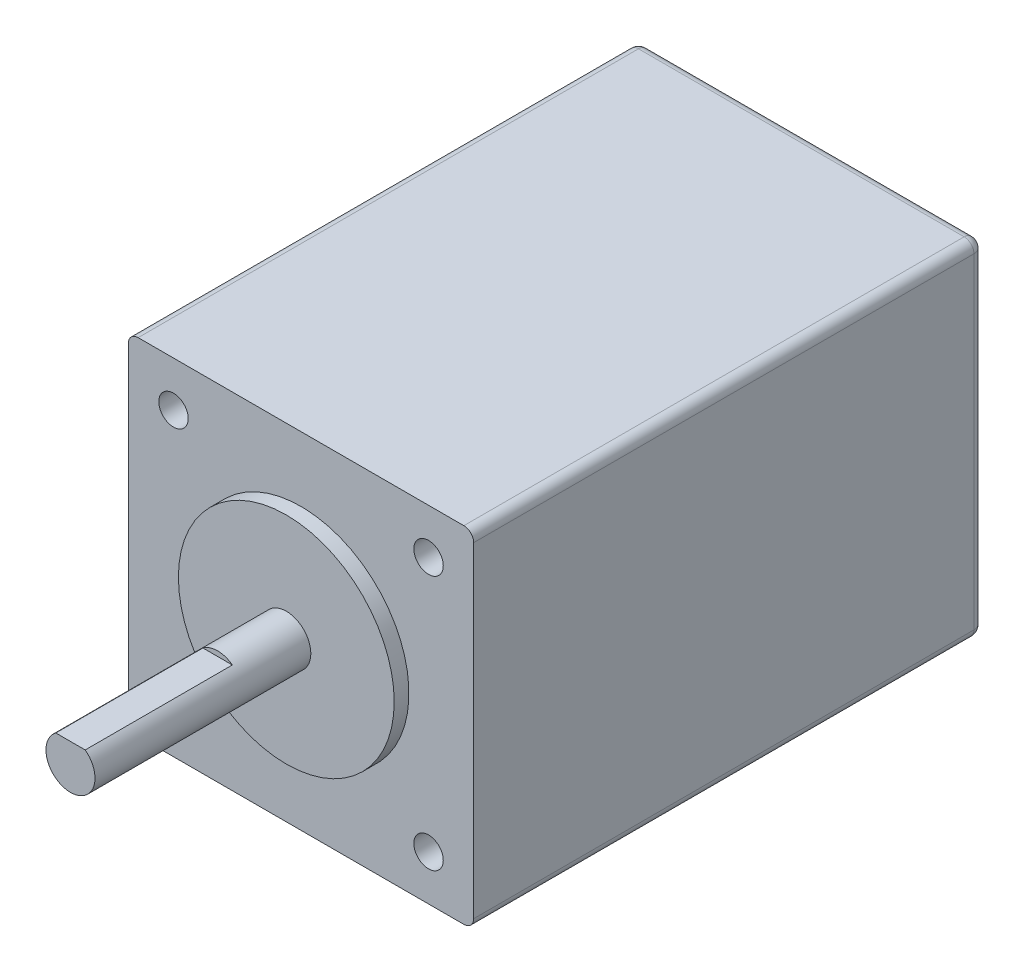
ISO-10303-21;
HEADER;
FILE_DESCRIPTION(('STEP AP214'),'2;1');
FILE_NAME('part.step','',(''),(''),'','','');
FILE_SCHEMA(('AUTOMOTIVE_DESIGN { 1 0 10303 214 1 1 1 1 }'));
ENDSEC;
DATA;
#1=APPLICATION_CONTEXT('core data for automotive mechanical design processes');
#2=APPLICATION_PROTOCOL_DEFINITION('international standard','automotive_design',2000,#1);
#3=PRODUCT_CONTEXT('',#1,'mechanical');
#4=PRODUCT('Part','Part','',(#3));
#5=PRODUCT_RELATED_PRODUCT_CATEGORY('part','',(#4));
#6=PRODUCT_DEFINITION_FORMATION('','',#4);
#7=PRODUCT_DEFINITION_CONTEXT('part definition',#1,'design');
#8=PRODUCT_DEFINITION('design','',#6,#7);
#9=PRODUCT_DEFINITION_SHAPE('','',#8);
#10=(LENGTH_UNIT() NAMED_UNIT(*) SI_UNIT(.MILLI.,.METRE.));
#11=(NAMED_UNIT(*) PLANE_ANGLE_UNIT() SI_UNIT($,.RADIAN.));
#12=(NAMED_UNIT(*) SI_UNIT($,.STERADIAN.) SOLID_ANGLE_UNIT());
#13=UNCERTAINTY_MEASURE_WITH_UNIT(LENGTH_MEASURE(1.E-05),#10,'distance_accuracy_value','');
#14=(GEOMETRIC_REPRESENTATION_CONTEXT(3) GLOBAL_UNCERTAINTY_ASSIGNED_CONTEXT((#13)) GLOBAL_UNIT_ASSIGNED_CONTEXT((#10,
#11,#12)) REPRESENTATION_CONTEXT('',''));
#15=CARTESIAN_POINT('',(0.,0.,0.));
#16=DIRECTION('',(0.,0.,1.));
#17=DIRECTION('',(1.,0.,0.));
#18=AXIS2_PLACEMENT_3D('',#15,#16,#17);
#19=CARTESIAN_POINT('',(0.,0.,53.5));
#20=DIRECTION('',(0.,0.,1.));
#21=DIRECTION('',(1.,0.,0.));
#22=AXIS2_PLACEMENT_3D('',#19,#20,#21);
#23=PLANE('',#22);
#24=CARTESIAN_POINT('',(0.,0.,53.5));
#25=DIRECTION('',(0.,0.,1.));
#26=DIRECTION('',(1.,0.,0.));
#27=AXIS2_PLACEMENT_3D('',#24,#25,#26);
#28=CIRCLE('',#27,11.);
#29=CARTESIAN_POINT('',(11.,0.,53.5));
#30=VERTEX_POINT('',#29);
#31=EDGE_CURVE('E144',#30,#30,#28,.T.);
#32=ORIENTED_EDGE('',*,*,#31,.T.);
#33=EDGE_LOOP('',(#32));
#34=FACE_BOUND('',#33,.T.);
#35=CARTESIAN_POINT('',(0.,0.,53.5));
#36=DIRECTION('',(0.,0.,1.));
#37=DIRECTION('',(1.,0.,0.));
#38=AXIS2_PLACEMENT_3D('',#35,#36,#37);
#39=CIRCLE('',#38,2.5);
#40=CARTESIAN_POINT('',(2.5,0.,53.5));
#41=VERTEX_POINT('',#40);
#42=EDGE_CURVE('E145',#41,#41,#39,.T.);
#43=ORIENTED_EDGE('',*,*,#42,.F.);
#44=EDGE_LOOP('',(#43));
#45=FACE_BOUND('',#44,.T.);
#46=ADVANCED_FACE('F33',(#34,#45),#23,.T.);
#47=CARTESIAN_POINT('',(17.6,17.6,52.));
#48=DIRECTION('',(0.,0.,-1.));
#49=DIRECTION('',(-1.,0.,0.));
#50=AXIS2_PLACEMENT_3D('',#47,#48,#49);
#51=PLANE('',#50);
#52=CARTESIAN_POINT('',(-12.9999999999997,-13.,52.));
#53=DIRECTION('',(0.,0.,1.));
#54=DIRECTION('',(1.,0.,0.));
#55=AXIS2_PLACEMENT_3D('',#52,#53,#54);
#56=CIRCLE('',#55,1.5);
#57=CARTESIAN_POINT('',(-11.4999999999997,-13.,52.));
#58=VERTEX_POINT('',#57);
#59=EDGE_CURVE('E237',#58,#58,#56,.T.);
#60=ORIENTED_EDGE('',*,*,#59,.F.);
#61=EDGE_LOOP('',(#60));
#62=FACE_BOUND('',#61,.T.);
#63=CARTESIAN_POINT('',(13.0000000000003,-12.9999999999997,52.));
#64=DIRECTION('',(0.,0.,1.));
#65=DIRECTION('',(1.,0.,0.));
#66=AXIS2_PLACEMENT_3D('',#63,#64,#65);
#67=CIRCLE('',#66,1.5);
#68=CARTESIAN_POINT('',(14.5000000000003,-12.9999999999997,52.));
#69=VERTEX_POINT('',#68);
#70=EDGE_CURVE('E245',#69,#69,#67,.T.);
#71=ORIENTED_EDGE('',*,*,#70,.F.);
#72=EDGE_LOOP('',(#71));
#73=FACE_BOUND('',#72,.T.);
#74=CARTESIAN_POINT('',(13.,13.0000000000003,52.));
#75=DIRECTION('',(0.,0.,1.));
#76=DIRECTION('',(1.,0.,0.));
#77=AXIS2_PLACEMENT_3D('',#74,#75,#76);
#78=CIRCLE('',#77,1.5);
#79=CARTESIAN_POINT('',(14.5,13.0000000000003,52.));
#80=VERTEX_POINT('',#79);
#81=EDGE_CURVE('E251',#80,#80,#78,.T.);
#82=ORIENTED_EDGE('',*,*,#81,.F.);
#83=EDGE_LOOP('',(#82));
#84=FACE_BOUND('',#83,.T.);
#85=CARTESIAN_POINT('',(-13.,13.,52.));
#86=DIRECTION('',(0.,0.,1.));
#87=DIRECTION('',(1.,0.,0.));
#88=AXIS2_PLACEMENT_3D('',#85,#86,#87);
#89=CIRCLE('',#88,1.5);
#90=CARTESIAN_POINT('',(-11.5,13.,52.));
#91=VERTEX_POINT('',#90);
#92=EDGE_CURVE('E257',#91,#91,#89,.T.);
#93=ORIENTED_EDGE('',*,*,#92,.F.);
#94=EDGE_LOOP('',(#93));
#95=FACE_BOUND('',#94,.T.);
#96=DIRECTION('',(0.,-1.,0.));
#97=VECTOR('',#96,1.);
#98=CARTESIAN_POINT('',(-17.6,-17.6,52.));
#99=LINE('',#98,#97);
#100=CARTESIAN_POINT('',(-17.6,16.6,52.));
#101=VERTEX_POINT('',#100);
#102=CARTESIAN_POINT('',(-17.6,-16.6,52.));
#103=VERTEX_POINT('',#102);
#104=EDGE_CURVE('E159',#101,#103,#99,.T.);
#105=ORIENTED_EDGE('',*,*,#104,.T.);
#106=CARTESIAN_POINT('',(-16.6,-16.6,52.));
#107=DIRECTION('',(0.,0.,-1.));
#108=DIRECTION('',(-1.,0.,0.));
#109=AXIS2_PLACEMENT_3D('',#106,#107,#108);
#110=CIRCLE('',#109,1.);
#111=CARTESIAN_POINT('',(-16.6,-17.6,52.));
#112=VERTEX_POINT('',#111);
#113=EDGE_CURVE('E11',#103,#112,#110,.F.);
#114=ORIENTED_EDGE('',*,*,#113,.T.);
#115=DIRECTION('',(1.,0.,0.));
#116=VECTOR('',#115,1.);
#117=CARTESIAN_POINT('',(-17.6,-17.6,52.));
#118=LINE('',#117,#116);
#119=CARTESIAN_POINT('',(16.6,-17.6,52.));
#120=VERTEX_POINT('',#119);
#121=EDGE_CURVE('E162',#112,#120,#118,.T.);
#122=ORIENTED_EDGE('',*,*,#121,.T.);
#123=CARTESIAN_POINT('',(16.6,-16.6,52.));
#124=DIRECTION('',(0.,0.,-1.));
#125=DIRECTION('',(-1.,0.,0.));
#126=AXIS2_PLACEMENT_3D('',#123,#124,#125);
#127=CIRCLE('',#126,1.);
#128=CARTESIAN_POINT('',(17.6,-16.6,52.));
#129=VERTEX_POINT('',#128);
#130=EDGE_CURVE('E42',#120,#129,#127,.F.);
#131=ORIENTED_EDGE('',*,*,#130,.T.);
#132=DIRECTION('',(0.,1.,0.));
#133=VECTOR('',#132,1.);
#134=CARTESIAN_POINT('',(17.6,-17.6,52.));
#135=LINE('',#134,#133);
#136=CARTESIAN_POINT('',(17.6,16.6,52.));
#137=VERTEX_POINT('',#136);
#138=EDGE_CURVE('E148',#129,#137,#135,.T.);
#139=ORIENTED_EDGE('',*,*,#138,.T.);
#140=CARTESIAN_POINT('',(16.6,16.6,52.));
#141=DIRECTION('',(0.,0.,-1.));
#142=DIRECTION('',(-1.,0.,0.));
#143=AXIS2_PLACEMENT_3D('',#140,#141,#142);
#144=CIRCLE('',#143,1.);
#145=CARTESIAN_POINT('',(16.6,17.6,52.));
#146=VERTEX_POINT('',#145);
#147=EDGE_CURVE('E200',#137,#146,#144,.F.);
#148=ORIENTED_EDGE('',*,*,#147,.T.);
#149=DIRECTION('',(-1.,0.,0.));
#150=VECTOR('',#149,1.);
#151=CARTESIAN_POINT('',(-17.6,17.6,52.));
#152=LINE('',#151,#150);
#153=CARTESIAN_POINT('',(-16.6,17.6,52.));
#154=VERTEX_POINT('',#153);
#155=EDGE_CURVE('E156',#146,#154,#152,.T.);
#156=ORIENTED_EDGE('',*,*,#155,.T.);
#157=CARTESIAN_POINT('',(-16.6,16.6,52.));
#158=DIRECTION('',(0.,0.,-1.));
#159=DIRECTION('',(-1.,0.,0.));
#160=AXIS2_PLACEMENT_3D('',#157,#158,#159);
#161=CIRCLE('',#160,1.);
#162=EDGE_CURVE('E202',#154,#101,#161,.F.);
#163=ORIENTED_EDGE('',*,*,#162,.T.);
#164=EDGE_LOOP('',(#105,#114,#122,#131,#139,#148,#156,#163));
#165=FACE_BOUND('',#164,.T.);
#166=CARTESIAN_POINT('',(0.,0.,52.));
#167=DIRECTION('',(0.,0.,-1.));
#168=DIRECTION('',(-1.,0.,0.));
#169=AXIS2_PLACEMENT_3D('',#166,#167,#168);
#170=CIRCLE('',#169,11.);
#171=CARTESIAN_POINT('',(-11.,0.,52.));
#172=VERTEX_POINT('',#171);
#173=EDGE_CURVE('E134',#172,#172,#170,.F.);
#174=ORIENTED_EDGE('',*,*,#173,.F.);
#175=EDGE_LOOP('',(#174));
#176=FACE_BOUND('',#175,.T.);
#177=ADVANCED_FACE('F278',(#62,#73,#84,#95,#165,#176),#51,.F.);
#178=CARTESIAN_POINT('',(17.6,-17.6,52.));
#179=DIRECTION('',(-1.,0.,0.));
#180=DIRECTION('',(0.,0.,1.));
#181=AXIS2_PLACEMENT_3D('',#178,#179,#180);
#182=PLANE('',#181);
#183=ORIENTED_EDGE('',*,*,#138,.F.);
#184=DIRECTION('',(0.,0.,-1.));
#185=VECTOR('',#184,1.);
#186=CARTESIAN_POINT('',(17.6,-16.6,52.));
#187=LINE('',#186,#185);
#188=CARTESIAN_POINT('',(17.6,-16.6,1.));
#189=VERTEX_POINT('',#188);
#190=EDGE_CURVE('E50',#129,#189,#187,.T.);
#191=ORIENTED_EDGE('',*,*,#190,.T.);
#192=DIRECTION('',(0.,1.,0.));
#193=VECTOR('',#192,1.);
#194=CARTESIAN_POINT('',(17.6,17.6,1.));
#195=LINE('',#194,#193);
#196=CARTESIAN_POINT('',(17.6,16.6,1.));
#197=VERTEX_POINT('',#196);
#198=EDGE_CURVE('E55',#189,#197,#195,.T.);
#199=ORIENTED_EDGE('',*,*,#198,.T.);
#200=DIRECTION('',(0.,0.,-1.));
#201=VECTOR('',#200,1.);
#202=CARTESIAN_POINT('',(17.6,16.6,52.));
#203=LINE('',#202,#201);
#204=EDGE_CURVE('E196',#197,#137,#203,.F.);
#205=ORIENTED_EDGE('',*,*,#204,.T.);
#206=EDGE_LOOP('',(#183,#191,#199,#205));
#207=FACE_BOUND('',#206,.T.);
#208=ADVANCED_FACE('F284',(#207),#182,.F.);
#209=CARTESIAN_POINT('',(-17.6,17.6,52.));
#210=DIRECTION('',(0.,-1.,0.));
#211=DIRECTION('',(0.,0.,-1.));
#212=AXIS2_PLACEMENT_3D('',#209,#210,#211);
#213=PLANE('',#212);
#214=DIRECTION('',(-1.,0.,0.));
#215=VECTOR('',#214,1.);
#216=CARTESIAN_POINT('',(-17.6,17.6,1.));
#217=LINE('',#216,#215);
#218=CARTESIAN_POINT('',(16.6,17.6,1.));
#219=VERTEX_POINT('',#218);
#220=CARTESIAN_POINT('',(-16.6,17.6,1.));
#221=VERTEX_POINT('',#220);
#222=EDGE_CURVE('E170',#219,#221,#217,.T.);
#223=ORIENTED_EDGE('',*,*,#222,.T.);
#224=DIRECTION('',(0.,0.,-1.));
#225=VECTOR('',#224,1.);
#226=CARTESIAN_POINT('',(-16.6,17.6,52.));
#227=LINE('',#226,#225);
#228=EDGE_CURVE('E173',#221,#154,#227,.F.);
#229=ORIENTED_EDGE('',*,*,#228,.T.);
#230=ORIENTED_EDGE('',*,*,#155,.F.);
#231=DIRECTION('',(0.,0.,-1.));
#232=VECTOR('',#231,1.);
#233=CARTESIAN_POINT('',(16.6,17.6,52.));
#234=LINE('',#233,#232);
#235=EDGE_CURVE('E168',#146,#219,#234,.T.);
#236=ORIENTED_EDGE('',*,*,#235,.T.);
#237=EDGE_LOOP('',(#223,#229,#230,#236));
#238=FACE_BOUND('',#237,.T.);
#239=ADVANCED_FACE('F305',(#238),#213,.F.);
#240=CARTESIAN_POINT('',(-17.6,-17.6,52.));
#241=DIRECTION('',(1.,0.,0.));
#242=DIRECTION('',(0.,0.,-1.));
#243=AXIS2_PLACEMENT_3D('',#240,#241,#242);
#244=PLANE('',#243);
#245=DIRECTION('',(0.,-1.,0.));
#246=VECTOR('',#245,1.);
#247=CARTESIAN_POINT('',(-17.6,-17.6,1.));
#248=LINE('',#247,#246);
#249=CARTESIAN_POINT('',(-17.6,16.6,1.));
#250=VERTEX_POINT('',#249);
#251=CARTESIAN_POINT('',(-17.6,-16.6,1.));
#252=VERTEX_POINT('',#251);
#253=EDGE_CURVE('E186',#250,#252,#248,.T.);
#254=ORIENTED_EDGE('',*,*,#253,.T.);
#255=DIRECTION('',(0.,0.,-1.));
#256=VECTOR('',#255,1.);
#257=CARTESIAN_POINT('',(-17.6,-16.6,52.));
#258=LINE('',#257,#256);
#259=EDGE_CURVE('E188',#252,#103,#258,.F.);
#260=ORIENTED_EDGE('',*,*,#259,.T.);
#261=ORIENTED_EDGE('',*,*,#104,.F.);
#262=DIRECTION('',(0.,0.,-1.));
#263=VECTOR('',#262,1.);
#264=CARTESIAN_POINT('',(-17.6,16.6,52.));
#265=LINE('',#264,#263);
#266=EDGE_CURVE('E184',#101,#250,#265,.T.);
#267=ORIENTED_EDGE('',*,*,#266,.T.);
#268=EDGE_LOOP('',(#254,#260,#261,#267));
#269=FACE_BOUND('',#268,.T.);
#270=ADVANCED_FACE('F301',(#269),#244,.F.);
#271=CARTESIAN_POINT('',(-17.6,-17.6,52.));
#272=DIRECTION('',(0.,1.,0.));
#273=DIRECTION('',(0.,0.,1.));
#274=AXIS2_PLACEMENT_3D('',#271,#272,#273);
#275=PLANE('',#274);
#276=ORIENTED_EDGE('',*,*,#121,.F.);
#277=DIRECTION('',(0.,0.,-1.));
#278=VECTOR('',#277,1.);
#279=CARTESIAN_POINT('',(-16.6,-17.6,52.));
#280=LINE('',#279,#278);
#281=CARTESIAN_POINT('',(-16.6,-17.6,1.));
#282=VERTEX_POINT('',#281);
#283=EDGE_CURVE('E194',#112,#282,#280,.T.);
#284=ORIENTED_EDGE('',*,*,#283,.T.);
#285=DIRECTION('',(1.,0.,0.));
#286=VECTOR('',#285,1.);
#287=CARTESIAN_POINT('',(17.6,-17.6,1.));
#288=LINE('',#287,#286);
#289=CARTESIAN_POINT('',(16.6,-17.6,1.));
#290=VERTEX_POINT('',#289);
#291=EDGE_CURVE('E192',#282,#290,#288,.T.);
#292=ORIENTED_EDGE('',*,*,#291,.T.);
#293=DIRECTION('',(0.,0.,-1.));
#294=VECTOR('',#293,1.);
#295=CARTESIAN_POINT('',(16.6,-17.6,52.));
#296=LINE('',#295,#294);
#297=EDGE_CURVE('E190',#290,#120,#296,.F.);
#298=ORIENTED_EDGE('',*,*,#297,.T.);
#299=EDGE_LOOP('',(#276,#284,#292,#298));
#300=FACE_BOUND('',#299,.T.);
#301=ADVANCED_FACE('F297',(#300),#275,.F.);
#302=CARTESIAN_POINT('',(17.6,17.6,0.));
#303=DIRECTION('',(0.,0.,-1.));
#304=DIRECTION('',(-1.,0.,0.));
#305=AXIS2_PLACEMENT_3D('',#302,#303,#304);
#306=PLANE('',#305);
#307=DIRECTION('',(0.,-1.,0.));
#308=VECTOR('',#307,1.);
#309=CARTESIAN_POINT('',(-16.6,17.6,0.));
#310=LINE('',#309,#308);
#311=CARTESIAN_POINT('',(-16.6,-16.6,0.));
#312=VERTEX_POINT('',#311);
#313=CARTESIAN_POINT('',(-16.6,16.6,0.));
#314=VERTEX_POINT('',#313);
#315=EDGE_CURVE('E179',#312,#314,#310,.F.);
#316=ORIENTED_EDGE('',*,*,#315,.T.);
#317=DIRECTION('',(-1.,0.,0.));
#318=VECTOR('',#317,1.);
#319=CARTESIAN_POINT('',(17.6,16.6,0.));
#320=LINE('',#319,#318);
#321=CARTESIAN_POINT('',(16.6,16.6,0.));
#322=VERTEX_POINT('',#321);
#323=EDGE_CURVE('E181',#314,#322,#320,.F.);
#324=ORIENTED_EDGE('',*,*,#323,.T.);
#325=DIRECTION('',(0.,1.,0.));
#326=VECTOR('',#325,1.);
#327=CARTESIAN_POINT('',(16.6,-17.6,0.));
#328=LINE('',#327,#326);
#329=CARTESIAN_POINT('',(16.6,-16.6,0.));
#330=VERTEX_POINT('',#329);
#331=EDGE_CURVE('E175',#322,#330,#328,.F.);
#332=ORIENTED_EDGE('',*,*,#331,.T.);
#333=DIRECTION('',(1.,0.,0.));
#334=VECTOR('',#333,1.);
#335=CARTESIAN_POINT('',(-17.6,-16.6,0.));
#336=LINE('',#335,#334);
#337=EDGE_CURVE('E177',#330,#312,#336,.F.);
#338=ORIENTED_EDGE('',*,*,#337,.T.);
#339=EDGE_LOOP('',(#316,#324,#332,#338));
#340=FACE_BOUND('',#339,.T.);
#341=ADVANCED_FACE('F292',(#340),#306,.T.);
#342=CARTESIAN_POINT('',(0.,0.,53.5));
#343=DIRECTION('',(0.,0.,-1.));
#344=DIRECTION('',(-1.,0.,0.));
#345=AXIS2_PLACEMENT_3D('',#342,#343,#344);
#346=CYLINDRICAL_SURFACE('',#345,11.);
#347=ORIENTED_EDGE('',*,*,#31,.F.);
#348=EDGE_LOOP('',(#347));
#349=FACE_BOUND('',#348,.T.);
#350=ORIENTED_EDGE('',*,*,#173,.T.);
#351=EDGE_LOOP('',(#350));
#352=FACE_BOUND('',#351,.T.);
#353=ADVANCED_FACE('F290',(#349,#352),#346,.T.);
#354=CARTESIAN_POINT('',(0.,0.,75.5));
#355=DIRECTION('',(0.,0.,-1.));
#356=DIRECTION('',(-1.,0.,0.));
#357=AXIS2_PLACEMENT_3D('',#354,#355,#356);
#358=CYLINDRICAL_SURFACE('',#357,2.5);
#359=CARTESIAN_POINT('',(0.,0.,75.5));
#360=DIRECTION('',(0.,0.,1.));
#361=DIRECTION('',(1.,0.,0.));
#362=AXIS2_PLACEMENT_3D('',#359,#360,#361);
#363=CIRCLE('',#362,2.5);
#364=CARTESIAN_POINT('',(-1.5,2.,75.5));
#365=VERTEX_POINT('',#364);
#366=CARTESIAN_POINT('',(1.5,2.,75.5));
#367=VERTEX_POINT('',#366);
#368=EDGE_CURVE('E140',#365,#367,#363,.T.);
#369=ORIENTED_EDGE('',*,*,#368,.F.);
#370=DIRECTION('',(0.,0.,-1.));
#371=VECTOR('',#370,1.);
#372=CARTESIAN_POINT('',(-1.5,2.,75.5));
#373=LINE('',#372,#371);
#374=CARTESIAN_POINT('',(-1.5,2.,60.5));
#375=VERTEX_POINT('',#374);
#376=EDGE_CURVE('E129',#365,#375,#373,.T.);
#377=ORIENTED_EDGE('',*,*,#376,.T.);
#378=CARTESIAN_POINT('',(0.,0.,60.5));
#379=DIRECTION('',(0.,0.,-1.));
#380=DIRECTION('',(-1.,0.,0.));
#381=AXIS2_PLACEMENT_3D('',#378,#379,#380);
#382=CIRCLE('',#381,2.5);
#383=CARTESIAN_POINT('',(1.5,2.,60.5));
#384=VERTEX_POINT('',#383);
#385=EDGE_CURVE('E133',#375,#384,#382,.T.);
#386=ORIENTED_EDGE('',*,*,#385,.T.);
#387=DIRECTION('',(0.,0.,-1.));
#388=VECTOR('',#387,1.);
#389=CARTESIAN_POINT('',(1.5,2.,75.5));
#390=LINE('',#389,#388);
#391=EDGE_CURVE('E126',#384,#367,#390,.F.);
#392=ORIENTED_EDGE('',*,*,#391,.T.);
#393=EDGE_LOOP('',(#369,#377,#386,#392));
#394=FACE_BOUND('',#393,.T.);
#395=ORIENTED_EDGE('',*,*,#42,.T.);
#396=EDGE_LOOP('',(#395));
#397=FACE_BOUND('',#396,.T.);
#398=ADVANCED_FACE('F138',(#394,#397),#358,.T.);
#399=CARTESIAN_POINT('',(0.,0.,75.5));
#400=DIRECTION('',(0.,0.,1.));
#401=DIRECTION('',(1.,0.,0.));
#402=AXIS2_PLACEMENT_3D('',#399,#400,#401);
#403=PLANE('',#402);
#404=DIRECTION('',(1.,0.,0.));
#405=VECTOR('',#404,1.);
#406=CARTESIAN_POINT('',(0.,2.,75.5));
#407=LINE('',#406,#405);
#408=EDGE_CURVE('E122',#365,#367,#407,.T.);
#409=ORIENTED_EDGE('',*,*,#408,.F.);
#410=ORIENTED_EDGE('',*,*,#368,.T.);
#411=EDGE_LOOP('',(#409,#410));
#412=FACE_BOUND('',#411,.T.);
#413=ADVANCED_FACE('F143',(#412),#403,.T.);
#414=CARTESIAN_POINT('',(-5.,2.5,60.5));
#415=DIRECTION('',(0.,0.,-1.));
#416=DIRECTION('',(-1.,0.,0.));
#417=AXIS2_PLACEMENT_3D('',#414,#415,#416);
#418=PLANE('',#417);
#419=DIRECTION('',(1.,0.,0.));
#420=VECTOR('',#419,1.);
#421=CARTESIAN_POINT('',(-5.,2.,60.5));
#422=LINE('',#421,#420);
#423=EDGE_CURVE('E141',#375,#384,#422,.T.);
#424=ORIENTED_EDGE('',*,*,#423,.T.);
#425=ORIENTED_EDGE('',*,*,#385,.F.);
#426=EDGE_LOOP('',(#424,#425));
#427=FACE_BOUND('',#426,.T.);
#428=ADVANCED_FACE('F266',(#427),#418,.F.);
#429=CARTESIAN_POINT('',(-5.,2.,75.5));
#430=DIRECTION('',(0.,-1.,0.));
#431=DIRECTION('',(0.,0.,-1.));
#432=AXIS2_PLACEMENT_3D('',#429,#430,#431);
#433=PLANE('',#432);
#434=ORIENTED_EDGE('',*,*,#408,.T.);
#435=ORIENTED_EDGE('',*,*,#391,.F.);
#436=ORIENTED_EDGE('',*,*,#423,.F.);
#437=ORIENTED_EDGE('',*,*,#376,.F.);
#438=EDGE_LOOP('',(#434,#435,#436,#437));
#439=FACE_BOUND('',#438,.T.);
#440=ADVANCED_FACE('F124',(#439),#433,.F.);
#441=CARTESIAN_POINT('',(-13.,13.,47.5));
#442=DIRECTION('',(0.,0.,1.));
#443=DIRECTION('',(1.,0.,0.));
#444=AXIS2_PLACEMENT_3D('',#441,#442,#443);
#445=CYLINDRICAL_SURFACE('',#444,1.5);
#446=CARTESIAN_POINT('',(-13.,13.,47.5));
#447=DIRECTION('',(0.,0.,1.));
#448=DIRECTION('',(1.,0.,0.));
#449=AXIS2_PLACEMENT_3D('',#446,#447,#448);
#450=CIRCLE('',#449,1.5);
#451=CARTESIAN_POINT('',(-11.5,13.,47.5));
#452=VERTEX_POINT('',#451);
#453=EDGE_CURVE('E260',#452,#452,#450,.T.);
#454=ORIENTED_EDGE('',*,*,#453,.F.);
#455=EDGE_LOOP('',(#454));
#456=FACE_BOUND('',#455,.T.);
#457=ORIENTED_EDGE('',*,*,#92,.T.);
#458=EDGE_LOOP('',(#457));
#459=FACE_BOUND('',#458,.T.);
#460=ADVANCED_FACE('F273',(#456,#459),#445,.F.);
#461=CARTESIAN_POINT('',(-13.,13.,47.5));
#462=DIRECTION('',(0.,0.,1.));
#463=DIRECTION('',(1.,0.,0.));
#464=AXIS2_PLACEMENT_3D('',#461,#462,#463);
#465=PLANE('',#464);
#466=ORIENTED_EDGE('',*,*,#453,.T.);
#467=EDGE_LOOP('',(#466));
#468=FACE_BOUND('',#467,.T.);
#469=ADVANCED_FACE('F418',(#468),#465,.T.);
#470=CARTESIAN_POINT('',(13.,13.0000000000003,47.5));
#471=DIRECTION('',(0.,0.,1.));
#472=DIRECTION('',(1.,0.,0.));
#473=AXIS2_PLACEMENT_3D('',#470,#471,#472);
#474=CYLINDRICAL_SURFACE('',#473,1.5);
#475=CARTESIAN_POINT('',(13.,13.0000000000003,47.5));
#476=DIRECTION('',(0.,0.,1.));
#477=DIRECTION('',(1.,0.,0.));
#478=AXIS2_PLACEMENT_3D('',#475,#476,#477);
#479=CIRCLE('',#478,1.5);
#480=CARTESIAN_POINT('',(14.5,13.0000000000003,47.5));
#481=VERTEX_POINT('',#480);
#482=EDGE_CURVE('E254',#481,#481,#479,.T.);
#483=ORIENTED_EDGE('',*,*,#482,.F.);
#484=EDGE_LOOP('',(#483));
#485=FACE_BOUND('',#484,.T.);
#486=ORIENTED_EDGE('',*,*,#81,.T.);
#487=EDGE_LOOP('',(#486));
#488=FACE_BOUND('',#487,.T.);
#489=ADVANCED_FACE('F414',(#485,#488),#474,.F.);
#490=CARTESIAN_POINT('',(13.,13.0000000000003,47.5));
#491=DIRECTION('',(0.,0.,1.));
#492=DIRECTION('',(1.,0.,0.));
#493=AXIS2_PLACEMENT_3D('',#490,#491,#492);
#494=PLANE('',#493);
#495=ORIENTED_EDGE('',*,*,#482,.T.);
#496=EDGE_LOOP('',(#495));
#497=FACE_BOUND('',#496,.T.);
#498=ADVANCED_FACE('F410',(#497),#494,.T.);
#499=CARTESIAN_POINT('',(13.0000000000003,-12.9999999999997,47.5));
#500=DIRECTION('',(0.,0.,1.));
#501=DIRECTION('',(1.,0.,0.));
#502=AXIS2_PLACEMENT_3D('',#499,#500,#501);
#503=CYLINDRICAL_SURFACE('',#502,1.5);
#504=CARTESIAN_POINT('',(13.0000000000003,-12.9999999999997,47.5));
#505=DIRECTION('',(0.,0.,1.));
#506=DIRECTION('',(1.,0.,0.));
#507=AXIS2_PLACEMENT_3D('',#504,#505,#506);
#508=CIRCLE('',#507,1.5);
#509=CARTESIAN_POINT('',(14.5000000000003,-12.9999999999997,47.5));
#510=VERTEX_POINT('',#509);
#511=EDGE_CURVE('E248',#510,#510,#508,.T.);
#512=ORIENTED_EDGE('',*,*,#511,.F.);
#513=EDGE_LOOP('',(#512));
#514=FACE_BOUND('',#513,.T.);
#515=ORIENTED_EDGE('',*,*,#70,.T.);
#516=EDGE_LOOP('',(#515));
#517=FACE_BOUND('',#516,.T.);
#518=ADVANCED_FACE('F406',(#514,#517),#503,.F.);
#519=CARTESIAN_POINT('',(13.0000000000003,-12.9999999999997,47.5));
#520=DIRECTION('',(0.,0.,1.));
#521=DIRECTION('',(1.,0.,0.));
#522=AXIS2_PLACEMENT_3D('',#519,#520,#521);
#523=PLANE('',#522);
#524=ORIENTED_EDGE('',*,*,#511,.T.);
#525=EDGE_LOOP('',(#524));
#526=FACE_BOUND('',#525,.T.);
#527=ADVANCED_FACE('F400',(#526),#523,.T.);
#528=CARTESIAN_POINT('',(-12.9999999999997,-13.,47.5));
#529=DIRECTION('',(0.,0.,1.));
#530=DIRECTION('',(1.,0.,0.));
#531=AXIS2_PLACEMENT_3D('',#528,#529,#530);
#532=CYLINDRICAL_SURFACE('',#531,1.5);
#533=CARTESIAN_POINT('',(-12.9999999999997,-13.,47.5));
#534=DIRECTION('',(0.,0.,1.));
#535=DIRECTION('',(1.,0.,0.));
#536=AXIS2_PLACEMENT_3D('',#533,#534,#535);
#537=CIRCLE('',#536,1.5);
#538=CARTESIAN_POINT('',(-11.4999999999997,-13.,47.5));
#539=VERTEX_POINT('',#538);
#540=EDGE_CURVE('E240',#539,#539,#537,.T.);
#541=ORIENTED_EDGE('',*,*,#540,.F.);
#542=EDGE_LOOP('',(#541));
#543=FACE_BOUND('',#542,.T.);
#544=ORIENTED_EDGE('',*,*,#59,.T.);
#545=EDGE_LOOP('',(#544));
#546=FACE_BOUND('',#545,.T.);
#547=ADVANCED_FACE('F394',(#543,#546),#532,.F.);
#548=CARTESIAN_POINT('',(-12.9999999999997,-13.,47.5));
#549=DIRECTION('',(0.,0.,1.));
#550=DIRECTION('',(1.,0.,0.));
#551=AXIS2_PLACEMENT_3D('',#548,#549,#550);
#552=PLANE('',#551);
#553=ORIENTED_EDGE('',*,*,#540,.T.);
#554=EDGE_LOOP('',(#553));
#555=FACE_BOUND('',#554,.T.);
#556=ADVANCED_FACE('F356',(#555),#552,.T.);
#557=CARTESIAN_POINT('',(16.6,-16.6,52.));
#558=DIRECTION('',(0.,0.,-1.));
#559=DIRECTION('',(-1.,0.,0.));
#560=AXIS2_PLACEMENT_3D('',#557,#558,#559);
#561=CYLINDRICAL_SURFACE('',#560,1.);
#562=ORIENTED_EDGE('',*,*,#130,.F.);
#563=ORIENTED_EDGE('',*,*,#297,.F.);
#564=CARTESIAN_POINT('',(16.6,-16.6,1.));
#565=DIRECTION('',(0.,0.,-1.));
#566=DIRECTION('',(-1.,0.,0.));
#567=AXIS2_PLACEMENT_3D('',#564,#565,#566);
#568=CIRCLE('',#567,1.);
#569=EDGE_CURVE('E232',#189,#290,#568,.T.);
#570=ORIENTED_EDGE('',*,*,#569,.F.);
#571=ORIENTED_EDGE('',*,*,#190,.F.);
#572=EDGE_LOOP('',(#562,#563,#570,#571));
#573=FACE_BOUND('',#572,.T.);
#574=ADVANCED_FACE('F35',(#573),#561,.T.);
#575=CARTESIAN_POINT('',(-16.6,-16.6,52.));
#576=DIRECTION('',(0.,0.,-1.));
#577=DIRECTION('',(-1.,0.,0.));
#578=AXIS2_PLACEMENT_3D('',#575,#576,#577);
#579=CYLINDRICAL_SURFACE('',#578,1.);
#580=ORIENTED_EDGE('',*,*,#113,.F.);
#581=ORIENTED_EDGE('',*,*,#259,.F.);
#582=CARTESIAN_POINT('',(-16.6,-16.6,1.));
#583=DIRECTION('',(0.,0.,-1.));
#584=DIRECTION('',(-1.,0.,0.));
#585=AXIS2_PLACEMENT_3D('',#582,#583,#584);
#586=CIRCLE('',#585,1.);
#587=EDGE_CURVE('E230',#282,#252,#586,.T.);
#588=ORIENTED_EDGE('',*,*,#587,.F.);
#589=ORIENTED_EDGE('',*,*,#283,.F.);
#590=EDGE_LOOP('',(#580,#581,#588,#589));
#591=FACE_BOUND('',#590,.T.);
#592=ADVANCED_FACE('F349',(#591),#579,.T.);
#593=CARTESIAN_POINT('',(-17.6,-16.6,1.));
#594=DIRECTION('',(-1.,0.,0.));
#595=DIRECTION('',(0.,0.,1.));
#596=AXIS2_PLACEMENT_3D('',#593,#594,#595);
#597=CYLINDRICAL_SURFACE('',#596,1.);
#598=CARTESIAN_POINT('',(16.6,-16.6,1.));
#599=DIRECTION('',(1.,0.,0.));
#600=DIRECTION('',(0.,0.,-1.));
#601=AXIS2_PLACEMENT_3D('',#598,#599,#600);
#602=CIRCLE('',#601,1.);
#603=EDGE_CURVE('E37',#290,#330,#602,.T.);
#604=ORIENTED_EDGE('',*,*,#603,.F.);
#605=ORIENTED_EDGE('',*,*,#291,.F.);
#606=CARTESIAN_POINT('',(-16.6,-16.6,1.));
#607=DIRECTION('',(-1.,0.,0.));
#608=DIRECTION('',(0.,0.,1.));
#609=AXIS2_PLACEMENT_3D('',#606,#607,#608);
#610=CIRCLE('',#609,1.);
#611=EDGE_CURVE('E227',#312,#282,#610,.T.);
#612=ORIENTED_EDGE('',*,*,#611,.F.);
#613=ORIENTED_EDGE('',*,*,#337,.F.);
#614=EDGE_LOOP('',(#604,#605,#612,#613));
#615=FACE_BOUND('',#614,.T.);
#616=ADVANCED_FACE('F347',(#615),#597,.T.);
#617=CARTESIAN_POINT('',(16.6,-16.6,1.));
#618=DIRECTION('',(0.,0.,1.));
#619=DIRECTION('',(1.,0.,0.));
#620=AXIS2_PLACEMENT_3D('',#617,#618,#619);
#621=SPHERICAL_SURFACE('',#620,1.);
#622=ORIENTED_EDGE('',*,*,#569,.T.);
#623=ORIENTED_EDGE('',*,*,#603,.T.);
#624=CARTESIAN_POINT('',(16.6,-16.6,1.));
#625=DIRECTION('',(0.,-1.,0.));
#626=DIRECTION('',(0.,0.,-1.));
#627=AXIS2_PLACEMENT_3D('',#624,#625,#626);
#628=CIRCLE('',#627,1.);
#629=EDGE_CURVE('E224',#189,#330,#628,.F.);
#630=ORIENTED_EDGE('',*,*,#629,.F.);
#631=EDGE_LOOP('',(#622,#623,#630));
#632=FACE_BOUND('',#631,.T.);
#633=ADVANCED_FACE('F343',(#632),#621,.T.);
#634=CARTESIAN_POINT('',(-16.6,-16.6,1.));
#635=DIRECTION('',(0.,0.,1.));
#636=DIRECTION('',(1.,0.,0.));
#637=AXIS2_PLACEMENT_3D('',#634,#635,#636);
#638=SPHERICAL_SURFACE('',#637,1.);
#639=ORIENTED_EDGE('',*,*,#611,.T.);
#640=ORIENTED_EDGE('',*,*,#587,.T.);
#641=CARTESIAN_POINT('',(-16.6,-16.6,1.));
#642=DIRECTION('',(0.,-1.,0.));
#643=DIRECTION('',(0.,0.,-1.));
#644=AXIS2_PLACEMENT_3D('',#641,#642,#643);
#645=CIRCLE('',#644,1.);
#646=EDGE_CURVE('E221',#312,#252,#645,.F.);
#647=ORIENTED_EDGE('',*,*,#646,.F.);
#648=EDGE_LOOP('',(#639,#640,#647));
#649=FACE_BOUND('',#648,.T.);
#650=ADVANCED_FACE('F339',(#649),#638,.T.);
#651=CARTESIAN_POINT('',(16.6,-17.6,1.));
#652=DIRECTION('',(0.,-1.,0.));
#653=DIRECTION('',(0.,0.,-1.));
#654=AXIS2_PLACEMENT_3D('',#651,#652,#653);
#655=CYLINDRICAL_SURFACE('',#654,1.);
#656=ORIENTED_EDGE('',*,*,#629,.T.);
#657=ORIENTED_EDGE('',*,*,#331,.F.);
#658=CARTESIAN_POINT('',(16.6,16.6,1.));
#659=DIRECTION('',(0.,1.,0.));
#660=DIRECTION('',(0.,0.,1.));
#661=AXIS2_PLACEMENT_3D('',#658,#659,#660);
#662=CIRCLE('',#661,1.);
#663=EDGE_CURVE('E218',#197,#322,#662,.T.);
#664=ORIENTED_EDGE('',*,*,#663,.F.);
#665=ORIENTED_EDGE('',*,*,#198,.F.);
#666=EDGE_LOOP('',(#656,#657,#664,#665));
#667=FACE_BOUND('',#666,.T.);
#668=ADVANCED_FACE('F335',(#667),#655,.T.);
#669=CARTESIAN_POINT('',(16.6,16.6,52.));
#670=DIRECTION('',(0.,0.,-1.));
#671=DIRECTION('',(-1.,0.,0.));
#672=AXIS2_PLACEMENT_3D('',#669,#670,#671);
#673=CYLINDRICAL_SURFACE('',#672,1.);
#674=ORIENTED_EDGE('',*,*,#147,.F.);
#675=ORIENTED_EDGE('',*,*,#204,.F.);
#676=CARTESIAN_POINT('',(16.6,16.6,1.));
#677=DIRECTION('',(0.,0.,-1.));
#678=DIRECTION('',(-1.,0.,0.));
#679=AXIS2_PLACEMENT_3D('',#676,#677,#678);
#680=CIRCLE('',#679,1.);
#681=EDGE_CURVE('E215',#219,#197,#680,.T.);
#682=ORIENTED_EDGE('',*,*,#681,.F.);
#683=ORIENTED_EDGE('',*,*,#235,.F.);
#684=EDGE_LOOP('',(#674,#675,#682,#683));
#685=FACE_BOUND('',#684,.T.);
#686=ADVANCED_FACE('F331',(#685),#673,.T.);
#687=CARTESIAN_POINT('',(-16.6,16.6,52.));
#688=DIRECTION('',(0.,0.,-1.));
#689=DIRECTION('',(-1.,0.,0.));
#690=AXIS2_PLACEMENT_3D('',#687,#688,#689);
#691=CYLINDRICAL_SURFACE('',#690,1.);
#692=ORIENTED_EDGE('',*,*,#162,.F.);
#693=ORIENTED_EDGE('',*,*,#228,.F.);
#694=CARTESIAN_POINT('',(-16.6,16.6,1.));
#695=DIRECTION('',(0.,0.,-1.));
#696=DIRECTION('',(-1.,0.,0.));
#697=AXIS2_PLACEMENT_3D('',#694,#695,#696);
#698=CIRCLE('',#697,1.);
#699=EDGE_CURVE('E212',#250,#221,#698,.T.);
#700=ORIENTED_EDGE('',*,*,#699,.F.);
#701=ORIENTED_EDGE('',*,*,#266,.F.);
#702=EDGE_LOOP('',(#692,#693,#700,#701));
#703=FACE_BOUND('',#702,.T.);
#704=ADVANCED_FACE('F327',(#703),#691,.T.);
#705=CARTESIAN_POINT('',(-16.6,-17.6,1.));
#706=DIRECTION('',(0.,1.,0.));
#707=DIRECTION('',(0.,0.,1.));
#708=AXIS2_PLACEMENT_3D('',#705,#706,#707);
#709=CYLINDRICAL_SURFACE('',#708,1.);
#710=ORIENTED_EDGE('',*,*,#646,.T.);
#711=ORIENTED_EDGE('',*,*,#253,.F.);
#712=CARTESIAN_POINT('',(-16.6,16.6,1.));
#713=DIRECTION('',(0.,1.,0.));
#714=DIRECTION('',(-1.,0.,0.));
#715=AXIS2_PLACEMENT_3D('',#712,#713,#714);
#716=CIRCLE('',#715,1.);
#717=EDGE_CURVE('E209',#314,#250,#716,.T.);
#718=ORIENTED_EDGE('',*,*,#717,.F.);
#719=ORIENTED_EDGE('',*,*,#315,.F.);
#720=EDGE_LOOP('',(#710,#711,#718,#719));
#721=FACE_BOUND('',#720,.T.);
#722=ADVANCED_FACE('F323',(#721),#709,.T.);
#723=CARTESIAN_POINT('',(16.6,16.6,1.));
#724=DIRECTION('',(0.,0.,1.));
#725=DIRECTION('',(1.,0.,0.));
#726=AXIS2_PLACEMENT_3D('',#723,#724,#725);
#727=SPHERICAL_SURFACE('',#726,1.);
#728=ORIENTED_EDGE('',*,*,#681,.T.);
#729=ORIENTED_EDGE('',*,*,#663,.T.);
#730=CARTESIAN_POINT('',(16.6,16.6,1.));
#731=DIRECTION('',(1.,0.,0.));
#732=DIRECTION('',(0.,1.,0.));
#733=AXIS2_PLACEMENT_3D('',#730,#731,#732);
#734=CIRCLE('',#733,1.);
#735=EDGE_CURVE('E207',#219,#322,#734,.F.);
#736=ORIENTED_EDGE('',*,*,#735,.F.);
#737=EDGE_LOOP('',(#728,#729,#736));
#738=FACE_BOUND('',#737,.T.);
#739=ADVANCED_FACE('F319',(#738),#727,.T.);
#740=CARTESIAN_POINT('',(-16.6,16.6,1.));
#741=DIRECTION('',(0.,0.,1.));
#742=DIRECTION('',(1.,0.,0.));
#743=AXIS2_PLACEMENT_3D('',#740,#741,#742);
#744=SPHERICAL_SURFACE('',#743,1.);
#745=ORIENTED_EDGE('',*,*,#717,.T.);
#746=ORIENTED_EDGE('',*,*,#699,.T.);
#747=CARTESIAN_POINT('',(-16.6,16.6,1.));
#748=DIRECTION('',(-1.,0.,0.));
#749=DIRECTION('',(0.,0.,1.));
#750=AXIS2_PLACEMENT_3D('',#747,#748,#749);
#751=CIRCLE('',#750,1.);
#752=EDGE_CURVE('E205',#314,#221,#751,.F.);
#753=ORIENTED_EDGE('',*,*,#752,.F.);
#754=EDGE_LOOP('',(#745,#746,#753));
#755=FACE_BOUND('',#754,.T.);
#756=ADVANCED_FACE('F315',(#755),#744,.T.);
#757=CARTESIAN_POINT('',(-17.6,16.6,1.));
#758=DIRECTION('',(1.,0.,0.));
#759=DIRECTION('',(0.,0.,-1.));
#760=AXIS2_PLACEMENT_3D('',#757,#758,#759);
#761=CYLINDRICAL_SURFACE('',#760,1.);
#762=ORIENTED_EDGE('',*,*,#735,.T.);
#763=ORIENTED_EDGE('',*,*,#323,.F.);
#764=ORIENTED_EDGE('',*,*,#752,.T.);
#765=ORIENTED_EDGE('',*,*,#222,.F.);
#766=EDGE_LOOP('',(#762,#763,#764,#765));
#767=FACE_BOUND('',#766,.T.);
#768=ADVANCED_FACE('F312',(#767),#761,.T.);
#769=CLOSED_SHELL('',(#46,#177,#208,#239,#270,#301,#341,#353,#398,#413,#428,#440,#460,#469,#489,
#498,#518,#527,#547,#556,#574,#592,#616,#633,#650,#668,#686,#704,#722,#739,#756,#768));
#770=MANIFOLD_SOLID_BREP('B2',#769);
#771=ADVANCED_BREP_SHAPE_REPRESENTATION('',(#18,#770),#14);
#772=SHAPE_DEFINITION_REPRESENTATION(#9,#771);
ENDSEC;
END-ISO-10303-21;
